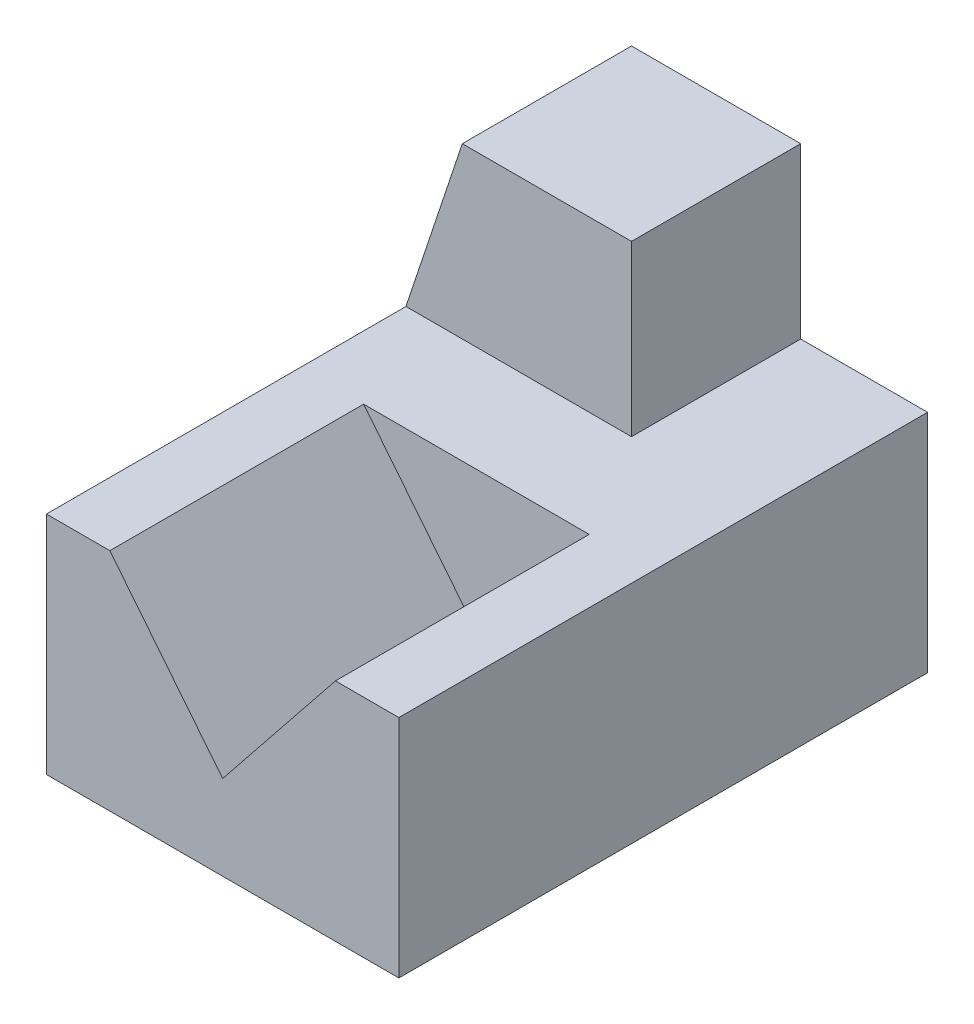
ISO-10303-21;
HEADER;
FILE_DESCRIPTION(('STEP AP214'),'2;1');
FILE_NAME('part.step','',(''),(''),'','','');
FILE_SCHEMA(('AUTOMOTIVE_DESIGN { 1 0 10303 214 1 1 1 1 }'));
ENDSEC;
DATA;
#1=APPLICATION_CONTEXT('core data for automotive mechanical design processes');
#2=APPLICATION_PROTOCOL_DEFINITION('international standard','automotive_design',2000,#1);
#3=PRODUCT_CONTEXT('',#1,'mechanical');
#4=PRODUCT('Part','Part','',(#3));
#5=PRODUCT_RELATED_PRODUCT_CATEGORY('part','',(#4));
#6=PRODUCT_DEFINITION_FORMATION('','',#4);
#7=PRODUCT_DEFINITION_CONTEXT('part definition',#1,'design');
#8=PRODUCT_DEFINITION('design','',#6,#7);
#9=PRODUCT_DEFINITION_SHAPE('','',#8);
#10=(LENGTH_UNIT() NAMED_UNIT(*) SI_UNIT(.MILLI.,.METRE.));
#11=(NAMED_UNIT(*) PLANE_ANGLE_UNIT() SI_UNIT($,.RADIAN.));
#12=(NAMED_UNIT(*) SI_UNIT($,.STERADIAN.) SOLID_ANGLE_UNIT());
#13=UNCERTAINTY_MEASURE_WITH_UNIT(LENGTH_MEASURE(1.E-05),#10,'distance_accuracy_value','');
#14=(GEOMETRIC_REPRESENTATION_CONTEXT(3) GLOBAL_UNCERTAINTY_ASSIGNED_CONTEXT((#13)) GLOBAL_UNIT_ASSIGNED_CONTEXT((#10,
#11,#12)) REPRESENTATION_CONTEXT('',''));
#15=CARTESIAN_POINT('',(0.,0.,0.));
#16=DIRECTION('',(0.,0.,1.));
#17=DIRECTION('',(1.,0.,0.));
#18=AXIS2_PLACEMENT_3D('',#15,#16,#17);
#19=CARTESIAN_POINT('',(0.,32.,75.));
#20=DIRECTION('',(0.,1.,0.));
#21=DIRECTION('',(0.,0.,1.));
#22=AXIS2_PLACEMENT_3D('',#19,#20,#21);
#23=PLANE('',#22);
#24=DIRECTION('',(-1.,0.,0.));
#25=VECTOR('',#24,1.);
#26=CARTESIAN_POINT('',(0.,32.,39.));
#27=LINE('',#26,#25);
#28=CARTESIAN_POINT('',(41.,32.,39.));
#29=VERTEX_POINT('',#28);
#30=CARTESIAN_POINT('',(8.99999999999999,32.,39.));
#31=VERTEX_POINT('',#30);
#32=EDGE_CURVE('E117',#29,#31,#27,.T.);
#33=ORIENTED_EDGE('',*,*,#32,.F.);
#34=DIRECTION('',(0.,0.,1.));
#35=VECTOR('',#34,1.);
#36=CARTESIAN_POINT('',(41.,32.,39.));
#37=LINE('',#36,#35);
#38=CARTESIAN_POINT('',(41.,32.,75.));
#39=VERTEX_POINT('',#38);
#40=EDGE_CURVE('E126',#29,#39,#37,.T.);
#41=ORIENTED_EDGE('',*,*,#40,.T.);
#42=DIRECTION('',(1.,0.,0.));
#43=VECTOR('',#42,1.);
#44=CARTESIAN_POINT('',(0.,32.,75.));
#45=LINE('',#44,#43);
#46=CARTESIAN_POINT('',(50.,32.,75.));
#47=VERTEX_POINT('',#46);
#48=EDGE_CURVE('E166',#39,#47,#45,.T.);
#49=ORIENTED_EDGE('',*,*,#48,.T.);
#50=DIRECTION('',(0.,0.,-1.));
#51=VECTOR('',#50,1.);
#52=CARTESIAN_POINT('',(50.,32.,75.));
#53=LINE('',#52,#51);
#54=CARTESIAN_POINT('',(50.,32.,0.));
#55=VERTEX_POINT('',#54);
#56=EDGE_CURVE('E11',#47,#55,#53,.T.);
#57=ORIENTED_EDGE('',*,*,#56,.T.);
#58=DIRECTION('',(1.,0.,0.));
#59=VECTOR('',#58,1.);
#60=CARTESIAN_POINT('',(0.,32.,0.));
#61=LINE('',#60,#59);
#62=CARTESIAN_POINT('',(32.,32.,0.));
#63=VERTEX_POINT('',#62);
#64=EDGE_CURVE('E179',#63,#55,#61,.T.);
#65=ORIENTED_EDGE('',*,*,#64,.F.);
#66=DIRECTION('',(0.,0.,-1.));
#67=VECTOR('',#66,1.);
#68=CARTESIAN_POINT('',(32.,32.,24.));
#69=LINE('',#68,#67);
#70=CARTESIAN_POINT('',(32.,32.,24.));
#71=VERTEX_POINT('',#70);
#72=EDGE_CURVE('E148',#71,#63,#69,.T.);
#73=ORIENTED_EDGE('',*,*,#72,.F.);
#74=DIRECTION('',(1.,0.,0.));
#75=VECTOR('',#74,1.);
#76=CARTESIAN_POINT('',(0.,32.,24.));
#77=LINE('',#76,#75);
#78=CARTESIAN_POINT('',(0.,32.,24.));
#79=VERTEX_POINT('',#78);
#80=EDGE_CURVE('E55',#79,#71,#77,.T.);
#81=ORIENTED_EDGE('',*,*,#80,.F.);
#82=DIRECTION('',(0.,0.,-1.));
#83=VECTOR('',#82,1.);
#84=CARTESIAN_POINT('',(0.,32.,75.));
#85=LINE('',#84,#83);
#86=CARTESIAN_POINT('',(0.,32.,75.));
#87=VERTEX_POINT('',#86);
#88=EDGE_CURVE('E40',#87,#79,#85,.T.);
#89=ORIENTED_EDGE('',*,*,#88,.F.);
#90=CARTESIAN_POINT('',(8.99999999999999,32.,75.));
#91=VERTEX_POINT('',#90);
#92=EDGE_CURVE('E168',#87,#91,#45,.T.);
#93=ORIENTED_EDGE('',*,*,#92,.T.);
#94=DIRECTION('',(0.,0.,1.));
#95=VECTOR('',#94,1.);
#96=CARTESIAN_POINT('',(8.99999999999999,32.,39.));
#97=LINE('',#96,#95);
#98=EDGE_CURVE('E47',#31,#91,#97,.T.);
#99=ORIENTED_EDGE('',*,*,#98,.F.);
#100=EDGE_LOOP('',(#33,#41,#49,#57,#65,#73,#81,#89,#93,#99));
#101=FACE_BOUND('',#100,.T.);
#102=ADVANCED_FACE('F32',(#101),#23,.T.);
#103=CARTESIAN_POINT('',(0.,0.,75.));
#104=DIRECTION('',(0.,0.,1.));
#105=DIRECTION('',(1.,0.,0.));
#106=AXIS2_PLACEMENT_3D('',#103,#104,#105);
#107=PLANE('',#106);
#108=ORIENTED_EDGE('',*,*,#48,.F.);
#109=DIRECTION('',(-0.624695047554424,-0.78086880944303,0.));
#110=VECTOR('',#109,1.);
#111=CARTESIAN_POINT('',(9.39024390243903,-7.51219512195122,75.));
#112=LINE('',#111,#110);
#113=CARTESIAN_POINT('',(25.,12.,75.));
#114=VERTEX_POINT('',#113);
#115=EDGE_CURVE('E220',#39,#114,#112,.T.);
#116=ORIENTED_EDGE('',*,*,#115,.T.);
#117=DIRECTION('',(-0.624695047554424,0.78086880944303,0.));
#118=VECTOR('',#117,1.);
#119=CARTESIAN_POINT('',(21.0975609756098,16.8780487804878,75.));
#120=LINE('',#119,#118);
#121=EDGE_CURVE('E127',#114,#91,#120,.T.);
#122=ORIENTED_EDGE('',*,*,#121,.T.);
#123=ORIENTED_EDGE('',*,*,#92,.F.);
#124=DIRECTION('',(0.,1.,0.));
#125=VECTOR('',#124,1.);
#126=CARTESIAN_POINT('',(0.,0.,75.));
#127=LINE('',#126,#125);
#128=CARTESIAN_POINT('',(0.,0.,75.));
#129=VERTEX_POINT('',#128);
#130=EDGE_CURVE('E171',#129,#87,#127,.T.);
#131=ORIENTED_EDGE('',*,*,#130,.F.);
#132=DIRECTION('',(1.,0.,0.));
#133=VECTOR('',#132,1.);
#134=CARTESIAN_POINT('',(0.,0.,75.));
#135=LINE('',#134,#133);
#136=CARTESIAN_POINT('',(50.,0.,75.));
#137=VERTEX_POINT('',#136);
#138=EDGE_CURVE('E174',#129,#137,#135,.T.);
#139=ORIENTED_EDGE('',*,*,#138,.T.);
#140=DIRECTION('',(0.,1.,0.));
#141=VECTOR('',#140,1.);
#142=CARTESIAN_POINT('',(50.,0.,75.));
#143=LINE('',#142,#141);
#144=EDGE_CURVE('E163',#137,#47,#143,.T.);
#145=ORIENTED_EDGE('',*,*,#144,.T.);
#146=EDGE_LOOP('',(#108,#116,#122,#123,#131,#139,#145));
#147=FACE_BOUND('',#146,.T.);
#148=ADVANCED_FACE('F217',(#147),#107,.T.);
#149=CARTESIAN_POINT('',(50.,0.,75.));
#150=DIRECTION('',(-1.,0.,0.));
#151=DIRECTION('',(0.,0.,1.));
#152=AXIS2_PLACEMENT_3D('',#149,#150,#151);
#153=PLANE('',#152);
#154=DIRECTION('',(0.,1.,0.));
#155=VECTOR('',#154,1.);
#156=CARTESIAN_POINT('',(50.,0.,0.));
#157=LINE('',#156,#155);
#158=CARTESIAN_POINT('',(50.,0.,0.));
#159=VERTEX_POINT('',#158);
#160=EDGE_CURVE('E162',#159,#55,#157,.T.);
#161=ORIENTED_EDGE('',*,*,#160,.T.);
#162=ORIENTED_EDGE('',*,*,#56,.F.);
#163=ORIENTED_EDGE('',*,*,#144,.F.);
#164=DIRECTION('',(0.,0.,-1.));
#165=VECTOR('',#164,1.);
#166=CARTESIAN_POINT('',(50.,0.,75.));
#167=LINE('',#166,#165);
#168=EDGE_CURVE('E176',#137,#159,#167,.T.);
#169=ORIENTED_EDGE('',*,*,#168,.T.);
#170=EDGE_LOOP('',(#161,#162,#163,#169));
#171=FACE_BOUND('',#170,.T.);
#172=ADVANCED_FACE('F34',(#171),#153,.F.);
#173=CARTESIAN_POINT('',(0.,0.,75.));
#174=DIRECTION('',(-1.,0.,0.));
#175=DIRECTION('',(0.,0.,1.));
#176=AXIS2_PLACEMENT_3D('',#173,#174,#175);
#177=PLANE('',#176);
#178=DIRECTION('',(0.,1.,0.));
#179=VECTOR('',#178,1.);
#180=CARTESIAN_POINT('',(0.,0.,0.));
#181=LINE('',#180,#179);
#182=CARTESIAN_POINT('',(0.,0.,0.));
#183=VERTEX_POINT('',#182);
#184=CARTESIAN_POINT('',(0.,32.,0.));
#185=VERTEX_POINT('',#184);
#186=EDGE_CURVE('E181',#183,#185,#181,.T.);
#187=ORIENTED_EDGE('',*,*,#186,.F.);
#188=DIRECTION('',(0.,0.,-1.));
#189=VECTOR('',#188,1.);
#190=CARTESIAN_POINT('',(0.,0.,75.));
#191=LINE('',#190,#189);
#192=EDGE_CURVE('E187',#129,#183,#191,.T.);
#193=ORIENTED_EDGE('',*,*,#192,.F.);
#194=ORIENTED_EDGE('',*,*,#130,.T.);
#195=ORIENTED_EDGE('',*,*,#88,.T.);
#196=DIRECTION('',(0.,0.,-1.));
#197=VECTOR('',#196,1.);
#198=CARTESIAN_POINT('',(0.,32.,24.));
#199=LINE('',#198,#197);
#200=EDGE_CURVE('E156',#79,#185,#199,.T.);
#201=ORIENTED_EDGE('',*,*,#200,.T.);
#202=EDGE_LOOP('',(#187,#193,#194,#195,#201));
#203=FACE_BOUND('',#202,.T.);
#204=ADVANCED_FACE('F191',(#203),#177,.T.);
#205=CARTESIAN_POINT('',(0.,0.,75.));
#206=DIRECTION('',(0.,1.,0.));
#207=DIRECTION('',(0.,0.,1.));
#208=AXIS2_PLACEMENT_3D('',#205,#206,#207);
#209=PLANE('',#208);
#210=DIRECTION('',(1.,0.,0.));
#211=VECTOR('',#210,1.);
#212=CARTESIAN_POINT('',(0.,0.,0.));
#213=LINE('',#212,#211);
#214=EDGE_CURVE('E167',#183,#159,#213,.T.);
#215=ORIENTED_EDGE('',*,*,#214,.T.);
#216=ORIENTED_EDGE('',*,*,#168,.F.);
#217=ORIENTED_EDGE('',*,*,#138,.F.);
#218=ORIENTED_EDGE('',*,*,#192,.T.);
#219=EDGE_LOOP('',(#215,#216,#217,#218));
#220=FACE_BOUND('',#219,.T.);
#221=ADVANCED_FACE('F213',(#220),#209,.F.);
#222=CARTESIAN_POINT('',(0.,0.,0.));
#223=DIRECTION('',(0.,0.,1.));
#224=DIRECTION('',(1.,0.,0.));
#225=AXIS2_PLACEMENT_3D('',#222,#223,#224);
#226=PLANE('',#225);
#227=ORIENTED_EDGE('',*,*,#160,.F.);
#228=ORIENTED_EDGE('',*,*,#214,.F.);
#229=ORIENTED_EDGE('',*,*,#186,.T.);
#230=DIRECTION('',(0.316227766016838,0.948683298050514,0.));
#231=VECTOR('',#230,1.);
#232=CARTESIAN_POINT('',(-9.60000000000001,3.20000000000001,0.));
#233=LINE('',#232,#231);
#234=CARTESIAN_POINT('',(8.,56.,0.));
#235=VERTEX_POINT('',#234);
#236=EDGE_CURVE('E142',#185,#235,#233,.T.);
#237=ORIENTED_EDGE('',*,*,#236,.T.);
#238=DIRECTION('',(1.,0.,0.));
#239=VECTOR('',#238,1.);
#240=CARTESIAN_POINT('',(0.,56.,0.));
#241=LINE('',#240,#239);
#242=CARTESIAN_POINT('',(32.,56.,0.));
#243=VERTEX_POINT('',#242);
#244=EDGE_CURVE('E133',#235,#243,#241,.T.);
#245=ORIENTED_EDGE('',*,*,#244,.T.);
#246=DIRECTION('',(0.,-1.,0.));
#247=VECTOR('',#246,1.);
#248=CARTESIAN_POINT('',(32.,0.,0.));
#249=LINE('',#248,#247);
#250=EDGE_CURVE('E130',#243,#63,#249,.T.);
#251=ORIENTED_EDGE('',*,*,#250,.T.);
#252=ORIENTED_EDGE('',*,*,#64,.T.);
#253=EDGE_LOOP('',(#227,#228,#229,#237,#245,#251,#252));
#254=FACE_BOUND('',#253,.T.);
#255=ADVANCED_FACE('F208',(#254),#226,.F.);
#256=CARTESIAN_POINT('',(32.,0.,24.));
#257=DIRECTION('',(1.,0.,0.));
#258=DIRECTION('',(0.,1.,0.));
#259=AXIS2_PLACEMENT_3D('',#256,#257,#258);
#260=PLANE('',#259);
#261=ORIENTED_EDGE('',*,*,#250,.F.);
#262=DIRECTION('',(0.,0.,-1.));
#263=VECTOR('',#262,1.);
#264=CARTESIAN_POINT('',(32.,56.,24.));
#265=LINE('',#264,#263);
#266=CARTESIAN_POINT('',(32.,56.,24.));
#267=VERTEX_POINT('',#266);
#268=EDGE_CURVE('E160',#267,#243,#265,.T.);
#269=ORIENTED_EDGE('',*,*,#268,.F.);
#270=DIRECTION('',(0.,-1.,0.));
#271=VECTOR('',#270,1.);
#272=CARTESIAN_POINT('',(32.,0.,24.));
#273=LINE('',#272,#271);
#274=EDGE_CURVE('E138',#267,#71,#273,.T.);
#275=ORIENTED_EDGE('',*,*,#274,.T.);
#276=ORIENTED_EDGE('',*,*,#72,.T.);
#277=EDGE_LOOP('',(#261,#269,#275,#276));
#278=FACE_BOUND('',#277,.T.);
#279=ADVANCED_FACE('F225',(#278),#260,.T.);
#280=CARTESIAN_POINT('',(0.,56.,24.));
#281=DIRECTION('',(0.,1.,0.));
#282=DIRECTION('',(0.,0.,1.));
#283=AXIS2_PLACEMENT_3D('',#280,#281,#282);
#284=PLANE('',#283);
#285=ORIENTED_EDGE('',*,*,#244,.F.);
#286=DIRECTION('',(0.,0.,-1.));
#287=VECTOR('',#286,1.);
#288=CARTESIAN_POINT('',(8.,56.,24.));
#289=LINE('',#288,#287);
#290=CARTESIAN_POINT('',(8.,56.,24.));
#291=VERTEX_POINT('',#290);
#292=EDGE_CURVE('E158',#291,#235,#289,.T.);
#293=ORIENTED_EDGE('',*,*,#292,.F.);
#294=DIRECTION('',(1.,0.,0.));
#295=VECTOR('',#294,1.);
#296=CARTESIAN_POINT('',(0.,56.,24.));
#297=LINE('',#296,#295);
#298=EDGE_CURVE('E141',#291,#267,#297,.T.);
#299=ORIENTED_EDGE('',*,*,#298,.T.);
#300=ORIENTED_EDGE('',*,*,#268,.T.);
#301=EDGE_LOOP('',(#285,#293,#299,#300));
#302=FACE_BOUND('',#301,.T.);
#303=ADVANCED_FACE('F204',(#302),#284,.T.);
#304=CARTESIAN_POINT('',(-9.60000000000001,3.20000000000001,24.));
#305=DIRECTION('',(-0.948683298050514,0.316227766016838,0.));
#306=DIRECTION('',(-0.316227766016838,-0.948683298050514,0.));
#307=AXIS2_PLACEMENT_3D('',#304,#305,#306);
#308=PLANE('',#307);
#309=ORIENTED_EDGE('',*,*,#236,.F.);
#310=ORIENTED_EDGE('',*,*,#200,.F.);
#311=DIRECTION('',(0.316227766016838,0.948683298050514,0.));
#312=VECTOR('',#311,1.);
#313=CARTESIAN_POINT('',(-9.60000000000001,3.20000000000001,24.));
#314=LINE('',#313,#312);
#315=EDGE_CURVE('E145',#79,#291,#314,.T.);
#316=ORIENTED_EDGE('',*,*,#315,.T.);
#317=ORIENTED_EDGE('',*,*,#292,.T.);
#318=EDGE_LOOP('',(#309,#310,#316,#317));
#319=FACE_BOUND('',#318,.T.);
#320=ADVANCED_FACE('F197',(#319),#308,.T.);
#321=CARTESIAN_POINT('',(0.,0.,24.));
#322=DIRECTION('',(0.,0.,1.));
#323=DIRECTION('',(1.,0.,0.));
#324=AXIS2_PLACEMENT_3D('',#321,#322,#323);
#325=PLANE('',#324);
#326=ORIENTED_EDGE('',*,*,#274,.F.);
#327=ORIENTED_EDGE('',*,*,#298,.F.);
#328=ORIENTED_EDGE('',*,*,#315,.F.);
#329=ORIENTED_EDGE('',*,*,#80,.T.);
#330=EDGE_LOOP('',(#326,#327,#328,#329));
#331=FACE_BOUND('',#330,.T.);
#332=ADVANCED_FACE('F201',(#331),#325,.T.);
#333=CARTESIAN_POINT('',(9.39024390243903,-7.51219512195122,39.));
#334=DIRECTION('',(-0.78086880944303,0.624695047554424,0.));
#335=DIRECTION('',(-0.624695047554424,-0.78086880944303,0.));
#336=AXIS2_PLACEMENT_3D('',#333,#334,#335);
#337=PLANE('',#336);
#338=ORIENTED_EDGE('',*,*,#115,.F.);
#339=ORIENTED_EDGE('',*,*,#40,.F.);
#340=DIRECTION('',(-0.624695047554424,-0.78086880944303,0.));
#341=VECTOR('',#340,1.);
#342=CARTESIAN_POINT('',(9.39024390243903,-7.51219512195122,39.));
#343=LINE('',#342,#341);
#344=CARTESIAN_POINT('',(25.,12.,39.));
#345=VERTEX_POINT('',#344);
#346=EDGE_CURVE('E115',#29,#345,#343,.T.);
#347=ORIENTED_EDGE('',*,*,#346,.T.);
#348=DIRECTION('',(0.,0.,1.));
#349=VECTOR('',#348,1.);
#350=CARTESIAN_POINT('',(25.,12.,39.));
#351=LINE('',#350,#349);
#352=EDGE_CURVE('E123',#345,#114,#351,.T.);
#353=ORIENTED_EDGE('',*,*,#352,.T.);
#354=EDGE_LOOP('',(#338,#339,#347,#353));
#355=FACE_BOUND('',#354,.T.);
#356=ADVANCED_FACE('F122',(#355),#337,.T.);
#357=CARTESIAN_POINT('',(21.0975609756098,16.8780487804878,39.));
#358=DIRECTION('',(0.78086880944303,0.624695047554424,0.));
#359=DIRECTION('',(-0.624695047554424,0.78086880944303,0.));
#360=AXIS2_PLACEMENT_3D('',#357,#358,#359);
#361=PLANE('',#360);
#362=ORIENTED_EDGE('',*,*,#121,.F.);
#363=ORIENTED_EDGE('',*,*,#352,.F.);
#364=DIRECTION('',(-0.624695047554424,0.78086880944303,0.));
#365=VECTOR('',#364,1.);
#366=CARTESIAN_POINT('',(21.0975609756098,16.8780487804878,39.));
#367=LINE('',#366,#365);
#368=EDGE_CURVE('E112',#345,#31,#367,.T.);
#369=ORIENTED_EDGE('',*,*,#368,.T.);
#370=ORIENTED_EDGE('',*,*,#98,.T.);
#371=EDGE_LOOP('',(#362,#363,#369,#370));
#372=FACE_BOUND('',#371,.T.);
#373=ADVANCED_FACE('F129',(#372),#361,.T.);
#374=CARTESIAN_POINT('',(0.,0.,39.));
#375=DIRECTION('',(0.,0.,-1.));
#376=DIRECTION('',(-1.,0.,0.));
#377=AXIS2_PLACEMENT_3D('',#374,#375,#376);
#378=PLANE('',#377);
#379=ORIENTED_EDGE('',*,*,#346,.F.);
#380=ORIENTED_EDGE('',*,*,#32,.T.);
#381=ORIENTED_EDGE('',*,*,#368,.F.);
#382=EDGE_LOOP('',(#379,#380,#381));
#383=FACE_BOUND('',#382,.T.);
#384=ADVANCED_FACE('F114',(#383),#378,.F.);
#385=CLOSED_SHELL('',(#102,#148,#172,#204,#221,#255,#279,#303,#320,#332,#356,#373,#384));
#386=MANIFOLD_SOLID_BREP('B2',#385);
#387=ADVANCED_BREP_SHAPE_REPRESENTATION('',(#18,#386),#14);
#388=SHAPE_DEFINITION_REPRESENTATION(#9,#387);
ENDSEC;
END-ISO-10303-21;
